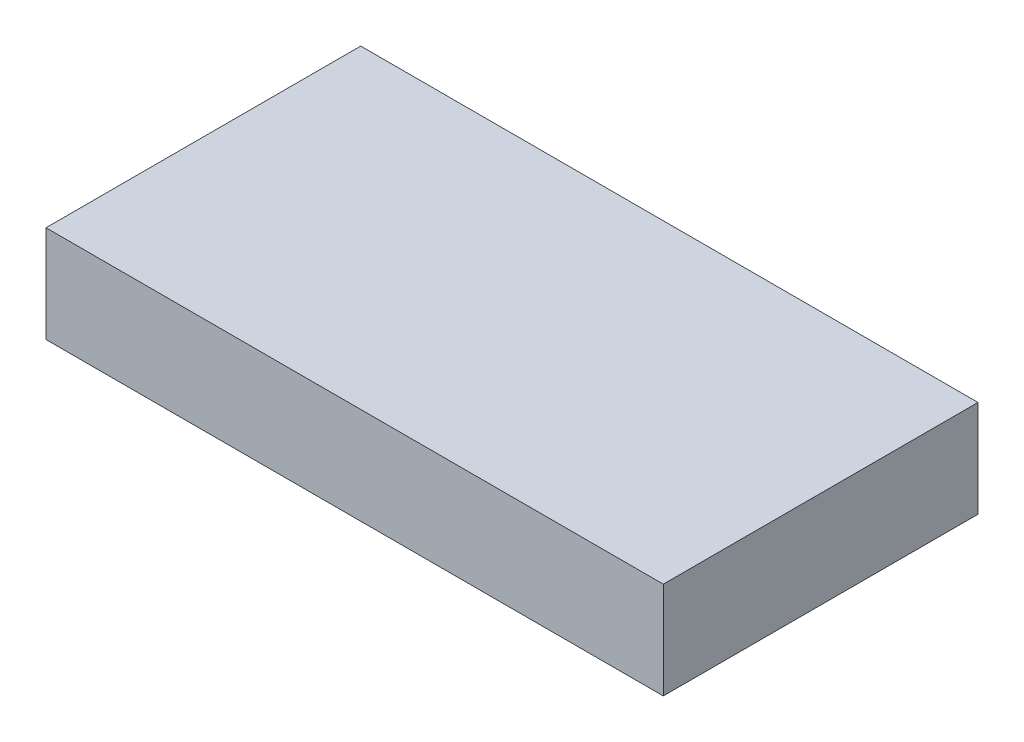
ISO-10303-21;
HEADER;
FILE_DESCRIPTION(('STEP AP214'),'2;1');
FILE_NAME('part.step','',(''),(''),'','','');
FILE_SCHEMA(('AUTOMOTIVE_DESIGN { 1 0 10303 214 1 1 1 1 }'));
ENDSEC;
DATA;
#1=APPLICATION_CONTEXT('core data for automotive mechanical design processes');
#2=APPLICATION_PROTOCOL_DEFINITION('international standard','automotive_design',2000,#1);
#3=PRODUCT_CONTEXT('',#1,'mechanical');
#4=PRODUCT('Part','Part','',(#3));
#5=PRODUCT_RELATED_PRODUCT_CATEGORY('part','',(#4));
#6=PRODUCT_DEFINITION_FORMATION('','',#4);
#7=PRODUCT_DEFINITION_CONTEXT('part definition',#1,'design');
#8=PRODUCT_DEFINITION('design','',#6,#7);
#9=PRODUCT_DEFINITION_SHAPE('','',#8);
#10=(LENGTH_UNIT() NAMED_UNIT(*) SI_UNIT(.MILLI.,.METRE.));
#11=(NAMED_UNIT(*) PLANE_ANGLE_UNIT() SI_UNIT($,.RADIAN.));
#12=(NAMED_UNIT(*) SI_UNIT($,.STERADIAN.) SOLID_ANGLE_UNIT());
#13=UNCERTAINTY_MEASURE_WITH_UNIT(LENGTH_MEASURE(1.E-05),#10,'distance_accuracy_value','');
#14=(GEOMETRIC_REPRESENTATION_CONTEXT(3) GLOBAL_UNCERTAINTY_ASSIGNED_CONTEXT((#13)) GLOBAL_UNIT_ASSIGNED_CONTEXT((#10,
#11,#12)) REPRESENTATION_CONTEXT('',''));
#15=CARTESIAN_POINT('',(0.,0.,0.));
#16=DIRECTION('',(0.,0.,1.));
#17=DIRECTION('',(1.,0.,0.));
#18=AXIS2_PLACEMENT_3D('',#15,#16,#17);
#19=CARTESIAN_POINT('',(0.,8.,0.));
#20=DIRECTION('',(1.,0.,0.));
#21=DIRECTION('',(0.,0.,-1.));
#22=AXIS2_PLACEMENT_3D('',#19,#20,#21);
#23=PLANE('',#22);
#24=DIRECTION('',(0.,0.,1.));
#25=VECTOR('',#24,1.);
#26=CARTESIAN_POINT('',(0.,0.,0.));
#27=LINE('',#26,#25);
#28=CARTESIAN_POINT('',(0.,0.,0.));
#29=VERTEX_POINT('',#28);
#30=CARTESIAN_POINT('',(0.,0.,26.));
#31=VERTEX_POINT('',#30);
#32=EDGE_CURVE('E98',#29,#31,#27,.T.);
#33=ORIENTED_EDGE('',*,*,#32,.T.);
#34=DIRECTION('',(0.,-1.,0.));
#35=VECTOR('',#34,1.);
#36=CARTESIAN_POINT('',(0.,8.,26.));
#37=LINE('',#36,#35);
#38=CARTESIAN_POINT('',(0.,8.,26.));
#39=VERTEX_POINT('',#38);
#40=EDGE_CURVE('E11',#39,#31,#37,.T.);
#41=ORIENTED_EDGE('',*,*,#40,.F.);
#42=DIRECTION('',(0.,0.,1.));
#43=VECTOR('',#42,1.);
#44=CARTESIAN_POINT('',(0.,8.,0.));
#45=LINE('',#44,#43);
#46=CARTESIAN_POINT('',(0.,8.,0.));
#47=VERTEX_POINT('',#46);
#48=EDGE_CURVE('E86',#47,#39,#45,.T.);
#49=ORIENTED_EDGE('',*,*,#48,.F.);
#50=DIRECTION('',(0.,-1.,0.));
#51=VECTOR('',#50,1.);
#52=CARTESIAN_POINT('',(0.,8.,0.));
#53=LINE('',#52,#51);
#54=EDGE_CURVE('E94',#47,#29,#53,.T.);
#55=ORIENTED_EDGE('',*,*,#54,.T.);
#56=EDGE_LOOP('',(#33,#41,#49,#55));
#57=FACE_BOUND('',#56,.T.);
#58=ADVANCED_FACE('F35',(#57),#23,.F.);
#59=CARTESIAN_POINT('',(0.,8.,26.));
#60=DIRECTION('',(0.,0.,-1.));
#61=DIRECTION('',(-1.,0.,0.));
#62=AXIS2_PLACEMENT_3D('',#59,#60,#61);
#63=PLANE('',#62);
#64=DIRECTION('',(1.,0.,0.));
#65=VECTOR('',#64,1.);
#66=CARTESIAN_POINT('',(0.,0.,26.));
#67=LINE('',#66,#65);
#68=CARTESIAN_POINT('',(51.,0.,26.));
#69=VERTEX_POINT('',#68);
#70=EDGE_CURVE('E90',#31,#69,#67,.T.);
#71=ORIENTED_EDGE('',*,*,#70,.T.);
#72=DIRECTION('',(0.,-1.,0.));
#73=VECTOR('',#72,1.);
#74=CARTESIAN_POINT('',(51.,8.,26.));
#75=LINE('',#74,#73);
#76=CARTESIAN_POINT('',(51.,8.,26.));
#77=VERTEX_POINT('',#76);
#78=EDGE_CURVE('E43',#77,#69,#75,.T.);
#79=ORIENTED_EDGE('',*,*,#78,.F.);
#80=DIRECTION('',(1.,0.,0.));
#81=VECTOR('',#80,1.);
#82=CARTESIAN_POINT('',(0.,8.,26.));
#83=LINE('',#82,#81);
#84=EDGE_CURVE('E81',#39,#77,#83,.T.);
#85=ORIENTED_EDGE('',*,*,#84,.F.);
#86=ORIENTED_EDGE('',*,*,#40,.T.);
#87=EDGE_LOOP('',(#71,#79,#85,#86));
#88=FACE_BOUND('',#87,.T.);
#89=ADVANCED_FACE('F89',(#88),#63,.F.);
#90=CARTESIAN_POINT('',(51.,8.,0.));
#91=DIRECTION('',(-1.,0.,0.));
#92=DIRECTION('',(0.,0.,1.));
#93=AXIS2_PLACEMENT_3D('',#90,#91,#92);
#94=PLANE('',#93);
#95=DIRECTION('',(0.,0.,-1.));
#96=VECTOR('',#95,1.);
#97=CARTESIAN_POINT('',(51.,0.,0.));
#98=LINE('',#97,#96);
#99=CARTESIAN_POINT('',(51.,0.,0.));
#100=VERTEX_POINT('',#99);
#101=EDGE_CURVE('E68',#69,#100,#98,.T.);
#102=ORIENTED_EDGE('',*,*,#101,.T.);
#103=DIRECTION('',(0.,-1.,0.));
#104=VECTOR('',#103,1.);
#105=CARTESIAN_POINT('',(51.,8.,0.));
#106=LINE('',#105,#104);
#107=CARTESIAN_POINT('',(51.,8.,0.));
#108=VERTEX_POINT('',#107);
#109=EDGE_CURVE('E91',#108,#100,#106,.T.);
#110=ORIENTED_EDGE('',*,*,#109,.F.);
#111=DIRECTION('',(0.,0.,-1.));
#112=VECTOR('',#111,1.);
#113=CARTESIAN_POINT('',(51.,8.,0.));
#114=LINE('',#113,#112);
#115=EDGE_CURVE('E84',#77,#108,#114,.T.);
#116=ORIENTED_EDGE('',*,*,#115,.F.);
#117=ORIENTED_EDGE('',*,*,#78,.T.);
#118=EDGE_LOOP('',(#102,#110,#116,#117));
#119=FACE_BOUND('',#118,.T.);
#120=ADVANCED_FACE('F92',(#119),#94,.F.);
#121=CARTESIAN_POINT('',(0.,8.,0.));
#122=DIRECTION('',(0.,0.,1.));
#123=DIRECTION('',(1.,0.,0.));
#124=AXIS2_PLACEMENT_3D('',#121,#122,#123);
#125=PLANE('',#124);
#126=DIRECTION('',(-1.,0.,0.));
#127=VECTOR('',#126,1.);
#128=CARTESIAN_POINT('',(0.,0.,0.));
#129=LINE('',#128,#127);
#130=EDGE_CURVE('E74',#100,#29,#129,.T.);
#131=ORIENTED_EDGE('',*,*,#130,.T.);
#132=ORIENTED_EDGE('',*,*,#54,.F.);
#133=DIRECTION('',(-1.,0.,0.));
#134=VECTOR('',#133,1.);
#135=CARTESIAN_POINT('',(0.,8.,0.));
#136=LINE('',#135,#134);
#137=EDGE_CURVE('E51',#108,#47,#136,.T.);
#138=ORIENTED_EDGE('',*,*,#137,.F.);
#139=ORIENTED_EDGE('',*,*,#109,.T.);
#140=EDGE_LOOP('',(#131,#132,#138,#139));
#141=FACE_BOUND('',#140,.T.);
#142=ADVANCED_FACE('F105',(#141),#125,.F.);
#143=CARTESIAN_POINT('',(0.,8.,0.));
#144=DIRECTION('',(0.,1.,0.));
#145=DIRECTION('',(0.,0.,1.));
#146=AXIS2_PLACEMENT_3D('',#143,#144,#145);
#147=PLANE('',#146);
#148=ORIENTED_EDGE('',*,*,#48,.T.);
#149=ORIENTED_EDGE('',*,*,#84,.T.);
#150=ORIENTED_EDGE('',*,*,#115,.T.);
#151=ORIENTED_EDGE('',*,*,#137,.T.);
#152=EDGE_LOOP('',(#148,#149,#150,#151));
#153=FACE_BOUND('',#152,.T.);
#154=ADVANCED_FACE('F82',(#153),#147,.T.);
#155=CARTESIAN_POINT('',(0.,0.,0.));
#156=DIRECTION('',(0.,1.,0.));
#157=DIRECTION('',(0.,0.,1.));
#158=AXIS2_PLACEMENT_3D('',#155,#156,#157);
#159=PLANE('',#158);
#160=ORIENTED_EDGE('',*,*,#32,.F.);
#161=ORIENTED_EDGE('',*,*,#130,.F.);
#162=ORIENTED_EDGE('',*,*,#101,.F.);
#163=ORIENTED_EDGE('',*,*,#70,.F.);
#164=EDGE_LOOP('',(#160,#161,#162,#163));
#165=FACE_BOUND('',#164,.T.);
#166=ADVANCED_FACE('F108',(#165),#159,.F.);
#167=CLOSED_SHELL('',(#58,#89,#120,#142,#154,#166));
#168=MANIFOLD_SOLID_BREP('B2',#167);
#169=ADVANCED_BREP_SHAPE_REPRESENTATION('',(#18,#168),#14);
#170=SHAPE_DEFINITION_REPRESENTATION(#9,#169);
ENDSEC;
END-ISO-10303-21;
